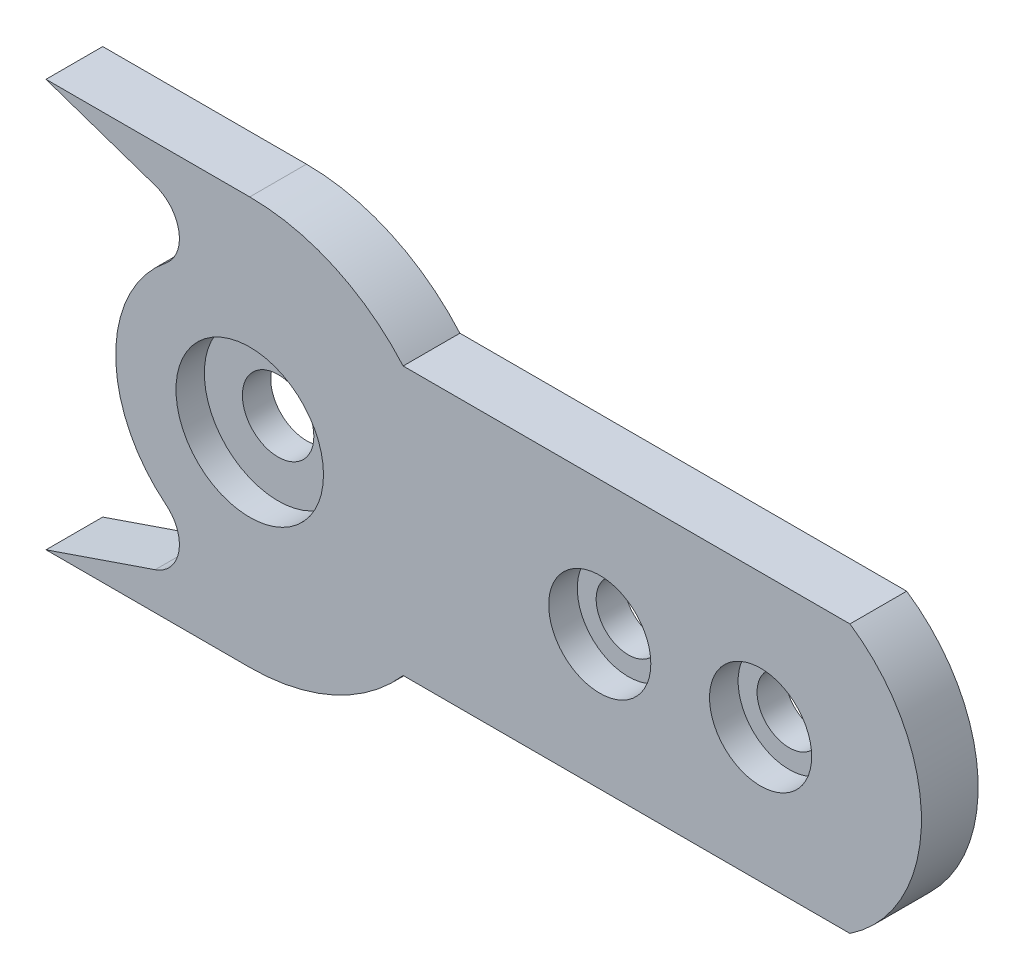
ISO-10303-21;
HEADER;
FILE_DESCRIPTION(('STEP AP214'),'2;1');
FILE_NAME('part.step','',(''),(''),'','','');
FILE_SCHEMA(('AUTOMOTIVE_DESIGN { 1 0 10303 214 1 1 1 1 }'));
ENDSEC;
DATA;
#1=APPLICATION_CONTEXT('core data for automotive mechanical design processes');
#2=APPLICATION_PROTOCOL_DEFINITION('international standard','automotive_design',2000,#1);
#3=PRODUCT_CONTEXT('',#1,'mechanical');
#4=PRODUCT('Part','Part','',(#3));
#5=PRODUCT_RELATED_PRODUCT_CATEGORY('part','',(#4));
#6=PRODUCT_DEFINITION_FORMATION('','',#4);
#7=PRODUCT_DEFINITION_CONTEXT('part definition',#1,'design');
#8=PRODUCT_DEFINITION('design','',#6,#7);
#9=PRODUCT_DEFINITION_SHAPE('','',#8);
#10=(LENGTH_UNIT() NAMED_UNIT(*) SI_UNIT(.MILLI.,.METRE.));
#11=(NAMED_UNIT(*) PLANE_ANGLE_UNIT() SI_UNIT($,.RADIAN.));
#12=(NAMED_UNIT(*) SI_UNIT($,.STERADIAN.) SOLID_ANGLE_UNIT());
#13=UNCERTAINTY_MEASURE_WITH_UNIT(LENGTH_MEASURE(1.E-05),#10,'distance_accuracy_value','');
#14=(GEOMETRIC_REPRESENTATION_CONTEXT(3) GLOBAL_UNCERTAINTY_ASSIGNED_CONTEXT((#13)) GLOBAL_UNIT_ASSIGNED_CONTEXT((#10,
#11,#12)) REPRESENTATION_CONTEXT('',''));
#15=CARTESIAN_POINT('',(0.,0.,0.));
#16=DIRECTION('',(0.,0.,1.));
#17=DIRECTION('',(1.,0.,0.));
#18=AXIS2_PLACEMENT_3D('',#15,#16,#17);
#19=CARTESIAN_POINT('',(-8.32667268468867E-13,1.83186799063151E-12,7.9375));
#20=DIRECTION('',(0.,0.,-1.));
#21=DIRECTION('',(-1.,0.,0.));
#22=AXIS2_PLACEMENT_3D('',#19,#20,#21);
#23=CYLINDRICAL_SURFACE('',#22,10.);
#24=CARTESIAN_POINT('',(-8.32667268468867E-13,1.83186799063151E-12,-7.9375));
#25=DIRECTION('',(0.,0.,1.));
#26=DIRECTION('',(1.,0.,0.));
#27=AXIS2_PLACEMENT_3D('',#24,#25,#26);
#28=CIRCLE('',#27,10.);
#29=CARTESIAN_POINT('',(9.99999999999917,1.83186799063151E-12,-7.9375));
#30=VERTEX_POINT('',#29);
#31=EDGE_CURVE('E212',#30,#30,#28,.T.);
#32=ORIENTED_EDGE('',*,*,#31,.F.);
#33=EDGE_LOOP('',(#32));
#34=FACE_BOUND('',#33,.T.);
#35=CARTESIAN_POINT('',(-8.32667268468867E-13,1.83186799063151E-12,0.));
#36=DIRECTION('',(0.,0.,1.));
#37=DIRECTION('',(1.,0.,0.));
#38=AXIS2_PLACEMENT_3D('',#35,#36,#37);
#39=CIRCLE('',#38,10.);
#40=CARTESIAN_POINT('',(9.99999999999917,1.83186799063151E-12,0.));
#41=VERTEX_POINT('',#40);
#42=EDGE_CURVE('E47',#41,#41,#39,.T.);
#43=ORIENTED_EDGE('',*,*,#42,.T.);
#44=EDGE_LOOP('',(#43));
#45=FACE_BOUND('',#44,.T.);
#46=ADVANCED_FACE('F43',(#34,#45),#23,.F.);
#47=CARTESIAN_POINT('',(-8.32667268468867E-13,1.83186799063151E-12,7.9375));
#48=DIRECTION('',(0.,0.,1.));
#49=DIRECTION('',(1.,0.,0.));
#50=AXIS2_PLACEMENT_3D('',#47,#48,#49);
#51=PLANE('',#50);
#52=CARTESIAN_POINT('',(-8.32667268468867E-13,1.83186799063151E-12,7.9375));
#53=DIRECTION('',(0.,0.,1.));
#54=DIRECTION('',(1.,0.,0.));
#55=AXIS2_PLACEMENT_3D('',#52,#53,#54);
#56=CIRCLE('',#55,20.6375);
#57=CARTESIAN_POINT('',(20.6374999999992,1.83186799063151E-12,7.9375));
#58=VERTEX_POINT('',#57);
#59=EDGE_CURVE('E576',#58,#58,#56,.T.);
#60=ORIENTED_EDGE('',*,*,#59,.F.);
#61=EDGE_LOOP('',(#60));
#62=FACE_BOUND('',#61,.T.);
#63=CARTESIAN_POINT('',(142.927264063763,0.,7.9375));
#64=DIRECTION('',(0.,0.,1.));
#65=DIRECTION('',(1.,0.,0.));
#66=AXIS2_PLACEMENT_3D('',#63,#64,#65);
#67=CIRCLE('',#66,14.2875);
#68=CARTESIAN_POINT('',(157.214764063763,0.,7.9375));
#69=VERTEX_POINT('',#68);
#70=EDGE_CURVE('E208',#69,#69,#67,.T.);
#71=ORIENTED_EDGE('',*,*,#70,.F.);
#72=EDGE_LOOP('',(#71));
#73=FACE_BOUND('',#72,.T.);
#74=CARTESIAN_POINT('',(97.9272640637625,0.,7.9375));
#75=DIRECTION('',(0.,0.,1.));
#76=DIRECTION('',(1.,0.,0.));
#77=AXIS2_PLACEMENT_3D('',#74,#75,#76);
#78=CIRCLE('',#77,14.2875);
#79=CARTESIAN_POINT('',(112.214764063763,0.,7.9375));
#80=VERTEX_POINT('',#79);
#81=EDGE_CURVE('E202',#80,#80,#78,.T.);
#82=ORIENTED_EDGE('',*,*,#81,.F.);
#83=EDGE_LOOP('',(#82));
#84=FACE_BOUND('',#83,.T.);
#85=CARTESIAN_POINT('',(-8.32667268468867E-13,1.83186799063151E-12,7.9375));
#86=DIRECTION('',(0.,0.,1.));
#87=DIRECTION('',(1.,0.,0.));
#88=AXIS2_PLACEMENT_3D('',#85,#86,#87);
#89=CIRCLE('',#88,57.0000000000018);
#90=CARTESIAN_POINT('',(0.,-57.,7.9375));
#91=VERTEX_POINT('',#90);
#92=CARTESIAN_POINT('',(42.9272640637625,-37.5,7.9375));
#93=VERTEX_POINT('',#92);
#94=EDGE_CURVE('E147',#91,#93,#89,.T.);
#95=ORIENTED_EDGE('',*,*,#94,.T.);
#96=DIRECTION('',(1.,0.,0.));
#97=VECTOR('',#96,1.);
#98=CARTESIAN_POINT('',(42.9272640637625,-37.5,7.9375));
#99=LINE('',#98,#97);
#100=CARTESIAN_POINT('',(167.927264063763,-37.5,7.9375));
#101=VERTEX_POINT('',#100);
#102=EDGE_CURVE('E135',#93,#101,#99,.T.);
#103=ORIENTED_EDGE('',*,*,#102,.T.);
#104=CARTESIAN_POINT('',(142.771014063763,0.,7.9375));
#105=DIRECTION('',(0.,0.,1.));
#106=DIRECTION('',(-1.,0.,0.));
#107=AXIS2_PLACEMENT_3D('',#104,#105,#106);
#108=CIRCLE('',#107,45.15625);
#109=CARTESIAN_POINT('',(167.927264063763,37.5,7.9375));
#110=VERTEX_POINT('',#109);
#111=EDGE_CURVE('E146',#101,#110,#108,.T.);
#112=ORIENTED_EDGE('',*,*,#111,.T.);
#113=DIRECTION('',(-1.,0.,0.));
#114=VECTOR('',#113,1.);
#115=CARTESIAN_POINT('',(42.9272640637625,37.5,7.9375));
#116=LINE('',#115,#114);
#117=CARTESIAN_POINT('',(42.9272640637621,37.4999999999996,7.9375));
#118=VERTEX_POINT('',#117);
#119=EDGE_CURVE('E219',#110,#118,#116,.T.);
#120=ORIENTED_EDGE('',*,*,#119,.T.);
#121=CARTESIAN_POINT('',(-8.32667268468867E-13,1.83186799063151E-12,7.9375));
#122=DIRECTION('',(0.,0.,1.));
#123=DIRECTION('',(-1.,0.,0.));
#124=AXIS2_PLACEMENT_3D('',#121,#122,#123);
#125=CIRCLE('',#124,56.9999999999988);
#126=CARTESIAN_POINT('',(0.,57.,7.9375));
#127=VERTEX_POINT('',#126);
#128=EDGE_CURVE('E222',#118,#127,#125,.T.);
#129=ORIENTED_EDGE('',*,*,#128,.T.);
#130=DIRECTION('',(-1.,0.,0.));
#131=VECTOR('',#130,1.);
#132=CARTESIAN_POINT('',(-57.,57.,7.9375));
#133=LINE('',#132,#131);
#134=CARTESIAN_POINT('',(-57.,57.,7.9375));
#135=VERTEX_POINT('',#134);
#136=EDGE_CURVE('E225',#127,#135,#133,.T.);
#137=ORIENTED_EDGE('',*,*,#136,.T.);
#138=DIRECTION('',(0.946163984953356,-0.32368767906299,0.));
#139=VECTOR('',#138,1.);
#140=CARTESIAN_POINT('',(-57.,57.,7.9375));
#141=LINE('',#140,#139);
#142=CARTESIAN_POINT('',(-26.4439875066651,46.5466273049118,7.9375));
#143=VERTEX_POINT('',#142);
#144=EDGE_CURVE('E228',#135,#143,#141,.T.);
#145=ORIENTED_EDGE('',*,*,#144,.T.);
#146=CARTESIAN_POINT('',(-29.680864297295,37.0849874553782,7.9375));
#147=DIRECTION('',(0.,0.,1.));
#148=DIRECTION('',(1.,0.,0.));
#149=AXIS2_PLACEMENT_3D('',#146,#147,#148);
#150=CIRCLE('',#149,10.);
#151=CARTESIAN_POINT('',(-23.4322612873382,29.2776216752986,7.9375));
#152=VERTEX_POINT('',#151);
#153=EDGE_CURVE('E11',#143,#152,#150,.F.);
#154=ORIENTED_EDGE('',*,*,#153,.T.);
#155=CARTESIAN_POINT('',(0.,0.,7.9375));
#156=DIRECTION('',(0.,0.,1.));
#157=DIRECTION('',(1.,0.,0.));
#158=AXIS2_PLACEMENT_3D('',#155,#156,#157);
#159=CIRCLE('',#158,37.5);
#160=CARTESIAN_POINT('',(-23.4322612873382,-29.2776216752986,7.9375));
#161=VERTEX_POINT('',#160);
#162=EDGE_CURVE('E231',#152,#161,#159,.T.);
#163=ORIENTED_EDGE('',*,*,#162,.T.);
#164=CARTESIAN_POINT('',(-29.680864297295,-37.0849874553782,7.9375));
#165=DIRECTION('',(0.,0.,1.));
#166=DIRECTION('',(1.,0.,0.));
#167=AXIS2_PLACEMENT_3D('',#164,#165,#166);
#168=CIRCLE('',#167,10.);
#169=CARTESIAN_POINT('',(-26.4439875066651,-46.5466273049118,7.9375));
#170=VERTEX_POINT('',#169);
#171=EDGE_CURVE('E185',#161,#170,#168,.F.);
#172=ORIENTED_EDGE('',*,*,#171,.T.);
#173=DIRECTION('',(-0.946163984953356,-0.32368767906299,0.));
#174=VECTOR('',#173,1.);
#175=CARTESIAN_POINT('',(-57.,-57.,7.9375));
#176=LINE('',#175,#174);
#177=CARTESIAN_POINT('',(-57.,-57.,7.9375));
#178=VERTEX_POINT('',#177);
#179=EDGE_CURVE('E235',#170,#178,#176,.T.);
#180=ORIENTED_EDGE('',*,*,#179,.T.);
#181=DIRECTION('',(1.,0.,0.));
#182=VECTOR('',#181,1.);
#183=CARTESIAN_POINT('',(-57.,-57.,7.9375));
#184=LINE('',#183,#182);
#185=EDGE_CURVE('E152',#178,#91,#184,.T.);
#186=ORIENTED_EDGE('',*,*,#185,.T.);
#187=EDGE_LOOP('',(#95,#103,#112,#120,#129,#137,#145,#154,#163,#172,#180,#186));
#188=FACE_BOUND('',#187,.T.);
#189=ADVANCED_FACE('F150',(#62,#73,#84,#188),#51,.T.);
#190=CARTESIAN_POINT('',(-8.32667268468867E-13,1.83186799063151E-12,-7.9375));
#191=DIRECTION('',(0.,0.,1.));
#192=DIRECTION('',(1.,0.,0.));
#193=AXIS2_PLACEMENT_3D('',#190,#191,#192);
#194=PLANE('',#193);
#195=CARTESIAN_POINT('',(97.9272640637625,0.,-7.9375));
#196=DIRECTION('',(0.,0.,1.));
#197=DIRECTION('',(1.,0.,0.));
#198=AXIS2_PLACEMENT_3D('',#195,#196,#197);
#199=CIRCLE('',#198,9.);
#200=CARTESIAN_POINT('',(106.927264063763,0.,-7.9375));
#201=VERTEX_POINT('',#200);
#202=EDGE_CURVE('E194',#201,#201,#199,.T.);
#203=ORIENTED_EDGE('',*,*,#202,.T.);
#204=EDGE_LOOP('',(#203));
#205=FACE_BOUND('',#204,.T.);
#206=CARTESIAN_POINT('',(142.927264063763,0.,-7.9375));
#207=DIRECTION('',(0.,0.,1.));
#208=DIRECTION('',(1.,0.,0.));
#209=AXIS2_PLACEMENT_3D('',#206,#207,#208);
#210=CIRCLE('',#209,9.00000000000001);
#211=CARTESIAN_POINT('',(151.927264063763,0.,-7.9375));
#212=VERTEX_POINT('',#211);
#213=EDGE_CURVE('E580',#212,#212,#210,.T.);
#214=ORIENTED_EDGE('',*,*,#213,.T.);
#215=EDGE_LOOP('',(#214));
#216=FACE_BOUND('',#215,.T.);
#217=CARTESIAN_POINT('',(-8.32667268468867E-13,1.83186799063151E-12,-7.9375));
#218=DIRECTION('',(0.,0.,1.));
#219=DIRECTION('',(1.,0.,0.));
#220=AXIS2_PLACEMENT_3D('',#217,#218,#219);
#221=CIRCLE('',#220,57.0000000000018);
#222=CARTESIAN_POINT('',(0.,-57.,-7.9375));
#223=VERTEX_POINT('',#222);
#224=CARTESIAN_POINT('',(42.9272640637625,-37.5,-7.9375));
#225=VERTEX_POINT('',#224);
#226=EDGE_CURVE('E161',#223,#225,#221,.T.);
#227=ORIENTED_EDGE('',*,*,#226,.F.);
#228=DIRECTION('',(1.,0.,0.));
#229=VECTOR('',#228,1.);
#230=CARTESIAN_POINT('',(-57.,-57.,-7.9375));
#231=LINE('',#230,#229);
#232=CARTESIAN_POINT('',(-57.,-57.,-7.9375));
#233=VERTEX_POINT('',#232);
#234=EDGE_CURVE('E157',#233,#223,#231,.T.);
#235=ORIENTED_EDGE('',*,*,#234,.F.);
#236=DIRECTION('',(-0.946163984953356,-0.32368767906299,0.));
#237=VECTOR('',#236,1.);
#238=CARTESIAN_POINT('',(-57.,-57.,-7.9375));
#239=LINE('',#238,#237);
#240=CARTESIAN_POINT('',(-26.4439875066651,-46.5466273049118,-7.9375));
#241=VERTEX_POINT('',#240);
#242=EDGE_CURVE('E265',#241,#233,#239,.T.);
#243=ORIENTED_EDGE('',*,*,#242,.F.);
#244=CARTESIAN_POINT('',(-29.680864297295,-37.0849874553782,-7.9375));
#245=DIRECTION('',(0.,0.,1.));
#246=DIRECTION('',(1.,0.,0.));
#247=AXIS2_PLACEMENT_3D('',#244,#245,#246);
#248=CIRCLE('',#247,10.);
#249=CARTESIAN_POINT('',(-23.4322612873382,-29.2776216752986,-7.9375));
#250=VERTEX_POINT('',#249);
#251=EDGE_CURVE('E182',#241,#250,#248,.T.);
#252=ORIENTED_EDGE('',*,*,#251,.T.);
#253=CARTESIAN_POINT('',(0.,0.,-7.9375));
#254=DIRECTION('',(0.,0.,1.));
#255=DIRECTION('',(1.,0.,0.));
#256=AXIS2_PLACEMENT_3D('',#253,#254,#255);
#257=CIRCLE('',#256,37.5);
#258=CARTESIAN_POINT('',(-23.4322612873382,29.2776216752986,-7.9375));
#259=VERTEX_POINT('',#258);
#260=EDGE_CURVE('E261',#259,#250,#257,.T.);
#261=ORIENTED_EDGE('',*,*,#260,.F.);
#262=CARTESIAN_POINT('',(-29.680864297295,37.0849874553782,-7.9375));
#263=DIRECTION('',(0.,0.,1.));
#264=DIRECTION('',(1.,0.,0.));
#265=AXIS2_PLACEMENT_3D('',#262,#263,#264);
#266=CIRCLE('',#265,10.);
#267=CARTESIAN_POINT('',(-26.4439875066651,46.5466273049118,-7.9375));
#268=VERTEX_POINT('',#267);
#269=EDGE_CURVE('E53',#259,#268,#266,.T.);
#270=ORIENTED_EDGE('',*,*,#269,.T.);
#271=DIRECTION('',(0.946163984953356,-0.32368767906299,0.));
#272=VECTOR('',#271,1.);
#273=CARTESIAN_POINT('',(-57.,57.,-7.9375));
#274=LINE('',#273,#272);
#275=CARTESIAN_POINT('',(-57.,57.,-7.9375));
#276=VERTEX_POINT('',#275);
#277=EDGE_CURVE('E258',#276,#268,#274,.T.);
#278=ORIENTED_EDGE('',*,*,#277,.F.);
#279=DIRECTION('',(-1.,0.,0.));
#280=VECTOR('',#279,1.);
#281=CARTESIAN_POINT('',(-57.,57.,-7.9375));
#282=LINE('',#281,#280);
#283=CARTESIAN_POINT('',(0.,57.,-7.9375));
#284=VERTEX_POINT('',#283);
#285=EDGE_CURVE('E255',#284,#276,#282,.T.);
#286=ORIENTED_EDGE('',*,*,#285,.F.);
#287=CARTESIAN_POINT('',(-8.32667268468867E-13,1.83186799063151E-12,-7.9375));
#288=DIRECTION('',(0.,0.,1.));
#289=DIRECTION('',(-1.,0.,0.));
#290=AXIS2_PLACEMENT_3D('',#287,#288,#289);
#291=CIRCLE('',#290,56.9999999999988);
#292=CARTESIAN_POINT('',(42.9272640637621,37.4999999999996,-7.9375));
#293=VERTEX_POINT('',#292);
#294=EDGE_CURVE('E252',#293,#284,#291,.T.);
#295=ORIENTED_EDGE('',*,*,#294,.F.);
#296=DIRECTION('',(-1.,0.,0.));
#297=VECTOR('',#296,1.);
#298=CARTESIAN_POINT('',(42.9272640637625,37.5,-7.9375));
#299=LINE('',#298,#297);
#300=CARTESIAN_POINT('',(167.927264063763,37.5,-7.9375));
#301=VERTEX_POINT('',#300);
#302=EDGE_CURVE('E249',#301,#293,#299,.T.);
#303=ORIENTED_EDGE('',*,*,#302,.F.);
#304=CARTESIAN_POINT('',(142.771014063763,0.,-7.9375));
#305=DIRECTION('',(0.,0.,1.));
#306=DIRECTION('',(-1.,0.,0.));
#307=AXIS2_PLACEMENT_3D('',#304,#305,#306);
#308=CIRCLE('',#307,45.15625);
#309=CARTESIAN_POINT('',(167.927264063763,-37.5,-7.9375));
#310=VERTEX_POINT('',#309);
#311=EDGE_CURVE('E246',#310,#301,#308,.T.);
#312=ORIENTED_EDGE('',*,*,#311,.F.);
#313=DIRECTION('',(1.,0.,0.));
#314=VECTOR('',#313,1.);
#315=CARTESIAN_POINT('',(42.9272640637625,-37.5,-7.9375));
#316=LINE('',#315,#314);
#317=EDGE_CURVE('E243',#225,#310,#316,.T.);
#318=ORIENTED_EDGE('',*,*,#317,.F.);
#319=EDGE_LOOP('',(#227,#235,#243,#252,#261,#270,#278,#286,#295,#303,#312,#318));
#320=FACE_BOUND('',#319,.T.);
#321=ORIENTED_EDGE('',*,*,#31,.T.);
#322=EDGE_LOOP('',(#321));
#323=FACE_BOUND('',#322,.T.);
#324=ADVANCED_FACE('F298',(#205,#216,#320,#323),#194,.F.);
#325=CARTESIAN_POINT('',(-8.32667268468867E-13,1.83186799063151E-12,7.9375));
#326=DIRECTION('',(0.,0.,-1.));
#327=DIRECTION('',(-1.,0.,0.));
#328=AXIS2_PLACEMENT_3D('',#325,#326,#327);
#329=CYLINDRICAL_SURFACE('',#328,57.0000000000018);
#330=ORIENTED_EDGE('',*,*,#226,.T.);
#331=DIRECTION('',(0.,0.,-1.));
#332=VECTOR('',#331,1.);
#333=CARTESIAN_POINT('',(42.9272640637625,-37.5,7.9375));
#334=LINE('',#333,#332);
#335=EDGE_CURVE('E139',#93,#225,#334,.T.);
#336=ORIENTED_EDGE('',*,*,#335,.F.);
#337=ORIENTED_EDGE('',*,*,#94,.F.);
#338=DIRECTION('',(0.,0.,-1.));
#339=VECTOR('',#338,1.);
#340=CARTESIAN_POINT('',(0.,-57.,7.9375));
#341=LINE('',#340,#339);
#342=EDGE_CURVE('E240',#91,#223,#341,.T.);
#343=ORIENTED_EDGE('',*,*,#342,.T.);
#344=EDGE_LOOP('',(#330,#336,#337,#343));
#345=FACE_BOUND('',#344,.T.);
#346=ADVANCED_FACE('F159',(#345),#329,.T.);
#347=CARTESIAN_POINT('',(42.9272640637625,-37.5,7.9375));
#348=DIRECTION('',(0.,1.,0.));
#349=DIRECTION('',(0.,0.,1.));
#350=AXIS2_PLACEMENT_3D('',#347,#348,#349);
#351=PLANE('',#350);
#352=ORIENTED_EDGE('',*,*,#317,.T.);
#353=DIRECTION('',(0.,0.,-1.));
#354=VECTOR('',#353,1.);
#355=CARTESIAN_POINT('',(167.927264063763,-37.5,7.9375));
#356=LINE('',#355,#354);
#357=EDGE_CURVE('E142',#101,#310,#356,.T.);
#358=ORIENTED_EDGE('',*,*,#357,.F.);
#359=ORIENTED_EDGE('',*,*,#102,.F.);
#360=ORIENTED_EDGE('',*,*,#335,.T.);
#361=EDGE_LOOP('',(#352,#358,#359,#360));
#362=FACE_BOUND('',#361,.T.);
#363=ADVANCED_FACE('F137',(#362),#351,.F.);
#364=CARTESIAN_POINT('',(142.771014063763,0.,7.9375));
#365=DIRECTION('',(0.,0.,-1.));
#366=DIRECTION('',(-1.,0.,0.));
#367=AXIS2_PLACEMENT_3D('',#364,#365,#366);
#368=CYLINDRICAL_SURFACE('',#367,45.15625);
#369=ORIENTED_EDGE('',*,*,#311,.T.);
#370=DIRECTION('',(0.,0.,-1.));
#371=VECTOR('',#370,1.);
#372=CARTESIAN_POINT('',(167.927264063763,37.5,7.9375));
#373=LINE('',#372,#371);
#374=EDGE_CURVE('E170',#110,#301,#373,.T.);
#375=ORIENTED_EDGE('',*,*,#374,.F.);
#376=ORIENTED_EDGE('',*,*,#111,.F.);
#377=ORIENTED_EDGE('',*,*,#357,.T.);
#378=EDGE_LOOP('',(#369,#375,#376,#377));
#379=FACE_BOUND('',#378,.T.);
#380=ADVANCED_FACE('F310',(#379),#368,.T.);
#381=CARTESIAN_POINT('',(42.9272640637625,37.5,7.9375));
#382=DIRECTION('',(0.,-1.,0.));
#383=DIRECTION('',(0.,0.,-1.));
#384=AXIS2_PLACEMENT_3D('',#381,#382,#383);
#385=PLANE('',#384);
#386=ORIENTED_EDGE('',*,*,#302,.T.);
#387=DIRECTION('',(0.,0.,-1.));
#388=VECTOR('',#387,1.);
#389=CARTESIAN_POINT('',(42.9272640637621,37.4999999999996,7.9375));
#390=LINE('',#389,#388);
#391=EDGE_CURVE('E284',#118,#293,#390,.T.);
#392=ORIENTED_EDGE('',*,*,#391,.F.);
#393=ORIENTED_EDGE('',*,*,#119,.F.);
#394=ORIENTED_EDGE('',*,*,#374,.T.);
#395=EDGE_LOOP('',(#386,#392,#393,#394));
#396=FACE_BOUND('',#395,.T.);
#397=ADVANCED_FACE('F293',(#396),#385,.F.);
#398=CARTESIAN_POINT('',(-8.32667268468867E-13,1.83186799063151E-12,7.9375));
#399=DIRECTION('',(0.,0.,-1.));
#400=DIRECTION('',(-1.,0.,0.));
#401=AXIS2_PLACEMENT_3D('',#398,#399,#400);
#402=CYLINDRICAL_SURFACE('',#401,56.9999999999988);
#403=ORIENTED_EDGE('',*,*,#294,.T.);
#404=DIRECTION('',(0.,0.,-1.));
#405=VECTOR('',#404,1.);
#406=CARTESIAN_POINT('',(0.,57.,7.9375));
#407=LINE('',#406,#405);
#408=EDGE_CURVE('E280',#127,#284,#407,.T.);
#409=ORIENTED_EDGE('',*,*,#408,.F.);
#410=ORIENTED_EDGE('',*,*,#128,.F.);
#411=ORIENTED_EDGE('',*,*,#391,.T.);
#412=EDGE_LOOP('',(#403,#409,#410,#411));
#413=FACE_BOUND('',#412,.T.);
#414=ADVANCED_FACE('F303',(#413),#402,.T.);
#415=CARTESIAN_POINT('',(-57.,57.,7.9375));
#416=DIRECTION('',(0.,-1.,0.));
#417=DIRECTION('',(0.,0.,-1.));
#418=AXIS2_PLACEMENT_3D('',#415,#416,#417);
#419=PLANE('',#418);
#420=ORIENTED_EDGE('',*,*,#285,.T.);
#421=DIRECTION('',(0.,0.,-1.));
#422=VECTOR('',#421,1.);
#423=CARTESIAN_POINT('',(-57.,57.,7.9375));
#424=LINE('',#423,#422);
#425=EDGE_CURVE('E276',#135,#276,#424,.T.);
#426=ORIENTED_EDGE('',*,*,#425,.F.);
#427=ORIENTED_EDGE('',*,*,#136,.F.);
#428=ORIENTED_EDGE('',*,*,#408,.T.);
#429=EDGE_LOOP('',(#420,#426,#427,#428));
#430=FACE_BOUND('',#429,.T.);
#431=ADVANCED_FACE('F307',(#430),#419,.F.);
#432=CARTESIAN_POINT('',(-57.,57.,7.9375));
#433=DIRECTION('',(0.32368767906299,0.946163984953356,0.));
#434=DIRECTION('',(-0.946163984953356,0.32368767906299,0.));
#435=AXIS2_PLACEMENT_3D('',#432,#433,#434);
#436=PLANE('',#435);
#437=ORIENTED_EDGE('',*,*,#277,.T.);
#438=DIRECTION('',(0.,0.,1.));
#439=VECTOR('',#438,1.);
#440=CARTESIAN_POINT('',(-26.4439875066651,46.5466273049118,7.9375));
#441=LINE('',#440,#439);
#442=EDGE_CURVE('E61',#268,#143,#441,.T.);
#443=ORIENTED_EDGE('',*,*,#442,.T.);
#444=ORIENTED_EDGE('',*,*,#144,.F.);
#445=ORIENTED_EDGE('',*,*,#425,.T.);
#446=EDGE_LOOP('',(#437,#443,#444,#445));
#447=FACE_BOUND('',#446,.T.);
#448=ADVANCED_FACE('F348',(#447),#436,.F.);
#449=CARTESIAN_POINT('',(0.,0.,7.9375));
#450=DIRECTION('',(0.,0.,-1.));
#451=DIRECTION('',(-1.,0.,0.));
#452=AXIS2_PLACEMENT_3D('',#449,#450,#451);
#453=CYLINDRICAL_SURFACE('',#452,37.5);
#454=ORIENTED_EDGE('',*,*,#260,.T.);
#455=DIRECTION('',(0.,0.,-1.));
#456=VECTOR('',#455,1.);
#457=CARTESIAN_POINT('',(-23.4322612873382,-29.2776216752986,7.9375));
#458=LINE('',#457,#456);
#459=EDGE_CURVE('E177',#250,#161,#458,.F.);
#460=ORIENTED_EDGE('',*,*,#459,.T.);
#461=ORIENTED_EDGE('',*,*,#162,.F.);
#462=DIRECTION('',(0.,0.,-1.));
#463=VECTOR('',#462,1.);
#464=CARTESIAN_POINT('',(-23.4322612873382,29.2776216752986,7.9375));
#465=LINE('',#464,#463);
#466=EDGE_CURVE('E168',#152,#259,#465,.T.);
#467=ORIENTED_EDGE('',*,*,#466,.T.);
#468=EDGE_LOOP('',(#454,#460,#461,#467));
#469=FACE_BOUND('',#468,.T.);
#470=ADVANCED_FACE('F344',(#469),#453,.T.);
#471=CARTESIAN_POINT('',(-57.,-57.,7.9375));
#472=DIRECTION('',(0.32368767906299,-0.946163984953356,0.));
#473=DIRECTION('',(0.946163984953356,0.32368767906299,0.));
#474=AXIS2_PLACEMENT_3D('',#471,#472,#473);
#475=PLANE('',#474);
#476=ORIENTED_EDGE('',*,*,#179,.F.);
#477=DIRECTION('',(0.,0.,1.));
#478=VECTOR('',#477,1.);
#479=CARTESIAN_POINT('',(-26.4439875066651,-46.5466273049118,-7.9375));
#480=LINE('',#479,#478);
#481=EDGE_CURVE('E163',#170,#241,#480,.F.);
#482=ORIENTED_EDGE('',*,*,#481,.T.);
#483=ORIENTED_EDGE('',*,*,#242,.T.);
#484=DIRECTION('',(0.,0.,-1.));
#485=VECTOR('',#484,1.);
#486=CARTESIAN_POINT('',(-57.,-57.,7.9375));
#487=LINE('',#486,#485);
#488=EDGE_CURVE('E272',#178,#233,#487,.T.);
#489=ORIENTED_EDGE('',*,*,#488,.F.);
#490=EDGE_LOOP('',(#476,#482,#483,#489));
#491=FACE_BOUND('',#490,.T.);
#492=ADVANCED_FACE('F340',(#491),#475,.F.);
#493=CARTESIAN_POINT('',(-57.,-57.,7.9375));
#494=DIRECTION('',(0.,1.,0.));
#495=DIRECTION('',(0.,0.,1.));
#496=AXIS2_PLACEMENT_3D('',#493,#494,#495);
#497=PLANE('',#496);
#498=ORIENTED_EDGE('',*,*,#234,.T.);
#499=ORIENTED_EDGE('',*,*,#342,.F.);
#500=ORIENTED_EDGE('',*,*,#185,.F.);
#501=ORIENTED_EDGE('',*,*,#488,.T.);
#502=EDGE_LOOP('',(#498,#499,#500,#501));
#503=FACE_BOUND('',#502,.T.);
#504=ADVANCED_FACE('F336',(#503),#497,.F.);
#505=CARTESIAN_POINT('',(-29.680864297295,-37.0849874553782,7.9375));
#506=DIRECTION('',(0.,0.,-1.));
#507=DIRECTION('',(-1.,0.,0.));
#508=AXIS2_PLACEMENT_3D('',#505,#506,#507);
#509=CYLINDRICAL_SURFACE('',#508,10.);
#510=ORIENTED_EDGE('',*,*,#171,.F.);
#511=ORIENTED_EDGE('',*,*,#459,.F.);
#512=ORIENTED_EDGE('',*,*,#251,.F.);
#513=ORIENTED_EDGE('',*,*,#481,.F.);
#514=EDGE_LOOP('',(#510,#511,#512,#513));
#515=FACE_BOUND('',#514,.T.);
#516=ADVANCED_FACE('F339',(#515),#509,.F.);
#517=CARTESIAN_POINT('',(-29.680864297295,37.0849874553782,7.9375));
#518=DIRECTION('',(0.,0.,-1.));
#519=DIRECTION('',(-1.,0.,0.));
#520=AXIS2_PLACEMENT_3D('',#517,#518,#519);
#521=CYLINDRICAL_SURFACE('',#520,10.);
#522=ORIENTED_EDGE('',*,*,#153,.F.);
#523=ORIENTED_EDGE('',*,*,#442,.F.);
#524=ORIENTED_EDGE('',*,*,#269,.F.);
#525=ORIENTED_EDGE('',*,*,#466,.F.);
#526=EDGE_LOOP('',(#522,#523,#524,#525));
#527=FACE_BOUND('',#526,.T.);
#528=ADVANCED_FACE('F45',(#527),#521,.F.);
#529=CARTESIAN_POINT('',(97.9272640637625,0.,-0.0625000000000001));
#530=DIRECTION('',(0.,0.,1.));
#531=DIRECTION('',(1.,0.,0.));
#532=AXIS2_PLACEMENT_3D('',#529,#530,#531);
#533=CYLINDRICAL_SURFACE('',#532,14.2875);
#534=CARTESIAN_POINT('',(97.9272640637625,0.,-0.0625000000000001));
#535=DIRECTION('',(0.,0.,1.));
#536=DIRECTION('',(1.,0.,0.));
#537=AXIS2_PLACEMENT_3D('',#534,#535,#536);
#538=CIRCLE('',#537,14.2875);
#539=CARTESIAN_POINT('',(112.214764063763,0.,-0.0625000000000001));
#540=VERTEX_POINT('',#539);
#541=EDGE_CURVE('E197',#540,#540,#538,.T.);
#542=ORIENTED_EDGE('',*,*,#541,.F.);
#543=EDGE_LOOP('',(#542));
#544=FACE_BOUND('',#543,.T.);
#545=ORIENTED_EDGE('',*,*,#81,.T.);
#546=EDGE_LOOP('',(#545));
#547=FACE_BOUND('',#546,.T.);
#548=ADVANCED_FACE('F391',(#544,#547),#533,.F.);
#549=CARTESIAN_POINT('',(97.9272640637625,0.,-0.0625000000000001));
#550=DIRECTION('',(0.,0.,1.));
#551=DIRECTION('',(1.,0.,0.));
#552=AXIS2_PLACEMENT_3D('',#549,#550,#551);
#553=PLANE('',#552);
#554=CARTESIAN_POINT('',(97.9272640637625,0.,-0.0625000000000001));
#555=DIRECTION('',(0.,0.,1.));
#556=DIRECTION('',(1.,0.,0.));
#557=AXIS2_PLACEMENT_3D('',#554,#555,#556);
#558=CIRCLE('',#557,9.);
#559=CARTESIAN_POINT('',(106.927264063763,0.,-0.0625000000000001));
#560=VERTEX_POINT('',#559);
#561=EDGE_CURVE('E193',#560,#560,#558,.T.);
#562=ORIENTED_EDGE('',*,*,#561,.F.);
#563=EDGE_LOOP('',(#562));
#564=FACE_BOUND('',#563,.T.);
#565=ORIENTED_EDGE('',*,*,#541,.T.);
#566=EDGE_LOOP('',(#565));
#567=FACE_BOUND('',#566,.T.);
#568=ADVANCED_FACE('F330',(#564,#567),#553,.T.);
#569=CARTESIAN_POINT('',(142.927264063763,0.,-0.0625000000000001));
#570=DIRECTION('',(0.,0.,1.));
#571=DIRECTION('',(1.,0.,0.));
#572=AXIS2_PLACEMENT_3D('',#569,#570,#571);
#573=CYLINDRICAL_SURFACE('',#572,14.2875);
#574=CARTESIAN_POINT('',(142.927264063763,0.,-0.0625000000000001));
#575=DIRECTION('',(0.,0.,1.));
#576=DIRECTION('',(1.,0.,0.));
#577=AXIS2_PLACEMENT_3D('',#574,#575,#576);
#578=CIRCLE('',#577,14.2875);
#579=CARTESIAN_POINT('',(157.214764063763,0.,-0.0625000000000001));
#580=VERTEX_POINT('',#579);
#581=EDGE_CURVE('E215',#580,#580,#578,.T.);
#582=ORIENTED_EDGE('',*,*,#581,.F.);
#583=EDGE_LOOP('',(#582));
#584=FACE_BOUND('',#583,.T.);
#585=ORIENTED_EDGE('',*,*,#70,.T.);
#586=EDGE_LOOP('',(#585));
#587=FACE_BOUND('',#586,.T.);
#588=ADVANCED_FACE('F405',(#584,#587),#573,.F.);
#589=CARTESIAN_POINT('',(142.927264063763,0.,-0.0625000000000001));
#590=DIRECTION('',(0.,0.,1.));
#591=DIRECTION('',(1.,0.,0.));
#592=AXIS2_PLACEMENT_3D('',#589,#590,#591);
#593=PLANE('',#592);
#594=CARTESIAN_POINT('',(142.927264063763,0.,-0.0625000000000001));
#595=DIRECTION('',(0.,0.,1.));
#596=DIRECTION('',(1.,0.,0.));
#597=AXIS2_PLACEMENT_3D('',#594,#595,#596);
#598=CIRCLE('',#597,9.00000000000001);
#599=CARTESIAN_POINT('',(151.927264063763,0.,-0.0625000000000001));
#600=VERTEX_POINT('',#599);
#601=EDGE_CURVE('E190',#600,#600,#598,.T.);
#602=ORIENTED_EDGE('',*,*,#601,.F.);
#603=EDGE_LOOP('',(#602));
#604=FACE_BOUND('',#603,.T.);
#605=ORIENTED_EDGE('',*,*,#581,.T.);
#606=EDGE_LOOP('',(#605));
#607=FACE_BOUND('',#606,.T.);
#608=ADVANCED_FACE('F413',(#604,#607),#593,.T.);
#609=CARTESIAN_POINT('',(142.927264063763,0.,-7.9375));
#610=DIRECTION('',(0.,0.,1.));
#611=DIRECTION('',(1.,0.,0.));
#612=AXIS2_PLACEMENT_3D('',#609,#610,#611);
#613=CYLINDRICAL_SURFACE('',#612,9.00000000000001);
#614=ORIENTED_EDGE('',*,*,#601,.T.);
#615=EDGE_LOOP('',(#614));
#616=FACE_BOUND('',#615,.T.);
#617=ORIENTED_EDGE('',*,*,#213,.F.);
#618=EDGE_LOOP('',(#617));
#619=FACE_BOUND('',#618,.T.);
#620=ADVANCED_FACE('F420',(#616,#619),#613,.F.);
#621=CARTESIAN_POINT('',(97.9272640637625,0.,-7.9375));
#622=DIRECTION('',(0.,0.,1.));
#623=DIRECTION('',(1.,0.,0.));
#624=AXIS2_PLACEMENT_3D('',#621,#622,#623);
#625=CYLINDRICAL_SURFACE('',#624,9.);
#626=ORIENTED_EDGE('',*,*,#561,.T.);
#627=EDGE_LOOP('',(#626));
#628=FACE_BOUND('',#627,.T.);
#629=ORIENTED_EDGE('',*,*,#202,.F.);
#630=EDGE_LOOP('',(#629));
#631=FACE_BOUND('',#630,.T.);
#632=ADVANCED_FACE('F428',(#628,#631),#625,.F.);
#633=CARTESIAN_POINT('',(-8.32667268468867E-13,1.83186799063151E-12,0.));
#634=DIRECTION('',(0.,0.,1.));
#635=DIRECTION('',(1.,0.,0.));
#636=AXIS2_PLACEMENT_3D('',#633,#634,#635);
#637=CYLINDRICAL_SURFACE('',#636,20.6375);
#638=CARTESIAN_POINT('',(-8.32667268468867E-13,1.83186799063151E-12,0.));
#639=DIRECTION('',(0.,0.,1.));
#640=DIRECTION('',(1.,0.,0.));
#641=AXIS2_PLACEMENT_3D('',#638,#639,#640);
#642=CIRCLE('',#641,20.6375);
#643=CARTESIAN_POINT('',(20.6374999999992,1.83186799063151E-12,0.));
#644=VERTEX_POINT('',#643);
#645=EDGE_CURVE('E574',#644,#644,#642,.T.);
#646=ORIENTED_EDGE('',*,*,#645,.F.);
#647=EDGE_LOOP('',(#646));
#648=FACE_BOUND('',#647,.T.);
#649=ORIENTED_EDGE('',*,*,#59,.T.);
#650=EDGE_LOOP('',(#649));
#651=FACE_BOUND('',#650,.T.);
#652=ADVANCED_FACE('F436',(#648,#651),#637,.F.);
#653=CARTESIAN_POINT('',(-8.32667268468867E-13,1.83186799063151E-12,0.));
#654=DIRECTION('',(0.,0.,1.));
#655=DIRECTION('',(1.,0.,0.));
#656=AXIS2_PLACEMENT_3D('',#653,#654,#655);
#657=PLANE('',#656);
#658=ORIENTED_EDGE('',*,*,#42,.F.);
#659=EDGE_LOOP('',(#658));
#660=FACE_BOUND('',#659,.T.);
#661=ORIENTED_EDGE('',*,*,#645,.T.);
#662=EDGE_LOOP('',(#661));
#663=FACE_BOUND('',#662,.T.);
#664=ADVANCED_FACE('F443',(#660,#663),#657,.T.);
#665=CLOSED_SHELL('',(#46,#189,#324,#346,#363,#380,#397,#414,#431,#448,#470,#492,#504,#516,#528,
#548,#568,#588,#608,#620,#632,#652,#664));
#666=MANIFOLD_SOLID_BREP('B2',#665);
#667=ADVANCED_BREP_SHAPE_REPRESENTATION('',(#18,#666),#14);
#668=SHAPE_DEFINITION_REPRESENTATION(#9,#667);
ENDSEC;
END-ISO-10303-21;
